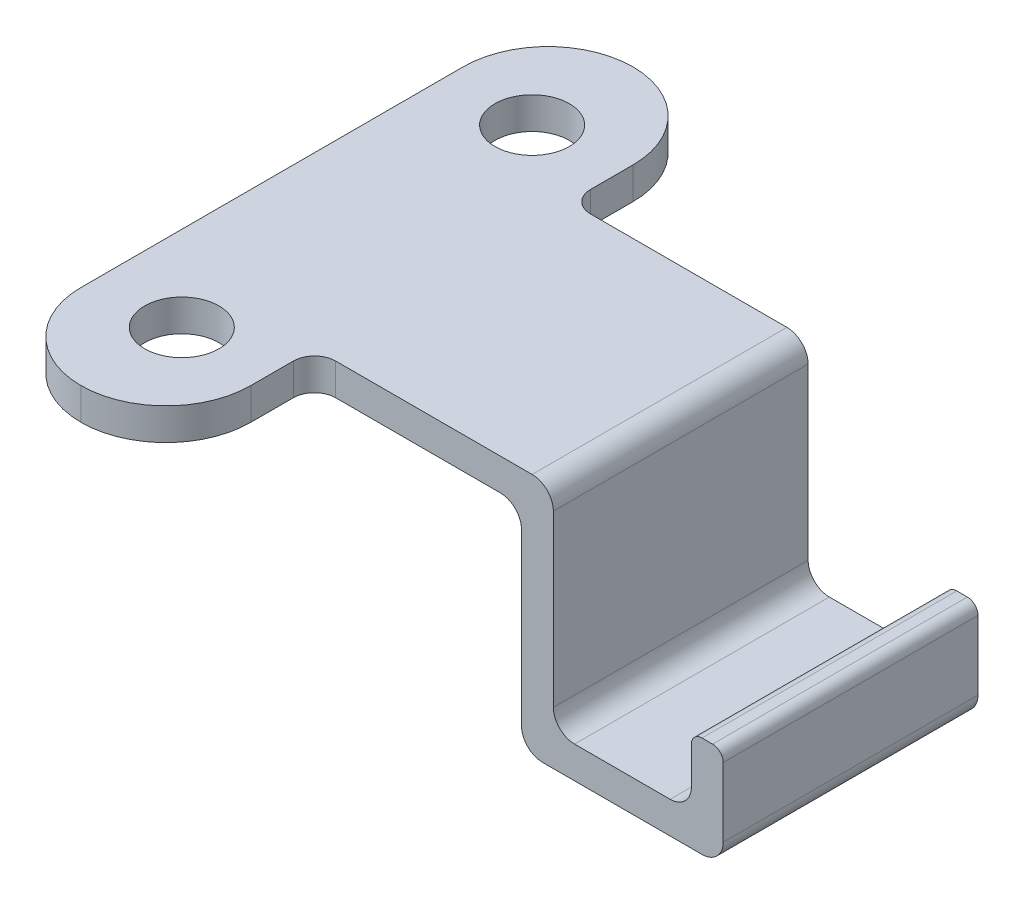
ISO-10303-21;
HEADER;
FILE_DESCRIPTION(('STEP AP214'),'2;1');
FILE_NAME('part.step','',(''),(''),'','','');
FILE_SCHEMA(('AUTOMOTIVE_DESIGN { 1 0 10303 214 1 1 1 1 }'));
ENDSEC;
DATA;
#1=APPLICATION_CONTEXT('core data for automotive mechanical design processes');
#2=APPLICATION_PROTOCOL_DEFINITION('international standard','automotive_design',2000,#1);
#3=PRODUCT_CONTEXT('',#1,'mechanical');
#4=PRODUCT('Part','Part','',(#3));
#5=PRODUCT_RELATED_PRODUCT_CATEGORY('part','',(#4));
#6=PRODUCT_DEFINITION_FORMATION('','',#4);
#7=PRODUCT_DEFINITION_CONTEXT('part definition',#1,'design');
#8=PRODUCT_DEFINITION('design','',#6,#7);
#9=PRODUCT_DEFINITION_SHAPE('','',#8);
#10=(LENGTH_UNIT() NAMED_UNIT(*) SI_UNIT(.MILLI.,.METRE.));
#11=(NAMED_UNIT(*) PLANE_ANGLE_UNIT() SI_UNIT($,.RADIAN.));
#12=(NAMED_UNIT(*) SI_UNIT($,.STERADIAN.) SOLID_ANGLE_UNIT());
#13=UNCERTAINTY_MEASURE_WITH_UNIT(LENGTH_MEASURE(1.E-05),#10,'distance_accuracy_value','');
#14=(GEOMETRIC_REPRESENTATION_CONTEXT(3) GLOBAL_UNCERTAINTY_ASSIGNED_CONTEXT((#13)) GLOBAL_UNIT_ASSIGNED_CONTEXT((#10,
#11,#12)) REPRESENTATION_CONTEXT('',''));
#15=CARTESIAN_POINT('',(0.,0.,0.));
#16=DIRECTION('',(0.,0.,1.));
#17=DIRECTION('',(1.,0.,0.));
#18=AXIS2_PLACEMENT_3D('',#15,#16,#17);
#19=CARTESIAN_POINT('',(0.,-0.75,13.));
#20=DIRECTION('',(1.,0.,0.));
#21=DIRECTION('',(0.,0.,-1.));
#22=AXIS2_PLACEMENT_3D('',#19,#20,#21);
#23=PLANE('',#22);
#24=DIRECTION('',(0.,0.,-1.));
#25=VECTOR('',#24,1.);
#26=CARTESIAN_POINT('',(0.,-0.75,13.));
#27=LINE('',#26,#25);
#28=CARTESIAN_POINT('',(0.,-0.75,9.));
#29=VERTEX_POINT('',#28);
#30=CARTESIAN_POINT('',(0.,-0.75,-8.99999999999999));
#31=VERTEX_POINT('',#30);
#32=EDGE_CURVE('E239',#29,#31,#27,.T.);
#33=ORIENTED_EDGE('',*,*,#32,.F.);
#34=DIRECTION('',(0.,-1.,0.));
#35=VECTOR('',#34,1.);
#36=CARTESIAN_POINT('',(0.,-0.75,9.));
#37=LINE('',#36,#35);
#38=CARTESIAN_POINT('',(0.,0.75,9.));
#39=VERTEX_POINT('',#38);
#40=EDGE_CURVE('E222',#29,#39,#37,.F.);
#41=ORIENTED_EDGE('',*,*,#40,.T.);
#42=DIRECTION('',(0.,0.,-1.));
#43=VECTOR('',#42,1.);
#44=CARTESIAN_POINT('',(0.,0.75,13.));
#45=LINE('',#44,#43);
#46=CARTESIAN_POINT('',(0.,0.75,-8.99999999999999));
#47=VERTEX_POINT('',#46);
#48=EDGE_CURVE('E244',#39,#47,#45,.T.);
#49=ORIENTED_EDGE('',*,*,#48,.T.);
#50=DIRECTION('',(0.,-1.,0.));
#51=VECTOR('',#50,1.);
#52=CARTESIAN_POINT('',(0.,-0.75,-9.));
#53=LINE('',#52,#51);
#54=EDGE_CURVE('E263',#47,#31,#53,.T.);
#55=ORIENTED_EDGE('',*,*,#54,.T.);
#56=EDGE_LOOP('',(#33,#41,#49,#55));
#57=FACE_BOUND('',#56,.T.);
#58=ADVANCED_FACE('F36',(#57),#23,.F.);
#59=CARTESIAN_POINT('',(0.,-0.75,13.));
#60=DIRECTION('',(0.,1.,0.));
#61=DIRECTION('',(0.,0.,1.));
#62=AXIS2_PLACEMENT_3D('',#59,#60,#61);
#63=PLANE('',#62);
#64=CARTESIAN_POINT('',(3.99999999999999,-0.75,-8.25));
#65=DIRECTION('',(0.,1.,0.));
#66=DIRECTION('',(0.,0.,1.));
#67=AXIS2_PLACEMENT_3D('',#64,#65,#66);
#68=CIRCLE('',#67,1.75);
#69=CARTESIAN_POINT('',(3.99999999999999,-0.75,-6.5));
#70=VERTEX_POINT('',#69);
#71=EDGE_CURVE('E424',#70,#70,#68,.T.);
#72=ORIENTED_EDGE('',*,*,#71,.T.);
#73=EDGE_LOOP('',(#72));
#74=FACE_BOUND('',#73,.T.);
#75=CARTESIAN_POINT('',(3.99999999999999,-0.75,8.25));
#76=DIRECTION('',(0.,1.,0.));
#77=DIRECTION('',(0.,0.,1.));
#78=AXIS2_PLACEMENT_3D('',#75,#76,#77);
#79=CIRCLE('',#78,1.75);
#80=CARTESIAN_POINT('',(3.99999999999999,-0.75,10.));
#81=VERTEX_POINT('',#80);
#82=EDGE_CURVE('E428',#81,#81,#79,.T.);
#83=ORIENTED_EDGE('',*,*,#82,.T.);
#84=EDGE_LOOP('',(#83));
#85=FACE_BOUND('',#84,.T.);
#86=DIRECTION('',(1.,0.,0.));
#87=VECTOR('',#86,1.);
#88=CARTESIAN_POINT('',(0.,-0.75,-6.));
#89=LINE('',#88,#87);
#90=CARTESIAN_POINT('',(9.,-0.75,-6.));
#91=VERTEX_POINT('',#90);
#92=CARTESIAN_POINT('',(16.75,-0.75,-6.));
#93=VERTEX_POINT('',#92);
#94=EDGE_CURVE('E394',#91,#93,#89,.T.);
#95=ORIENTED_EDGE('',*,*,#94,.T.);
#96=DIRECTION('',(0.,0.,-1.));
#97=VECTOR('',#96,1.);
#98=CARTESIAN_POINT('',(16.75,-0.75,6.));
#99=LINE('',#98,#97);
#100=CARTESIAN_POINT('',(16.75,-0.75,6.));
#101=VERTEX_POINT('',#100);
#102=EDGE_CURVE('E327',#93,#101,#99,.F.);
#103=ORIENTED_EDGE('',*,*,#102,.T.);
#104=DIRECTION('',(-1.,0.,0.));
#105=VECTOR('',#104,1.);
#106=CARTESIAN_POINT('',(0.,-0.75,6.));
#107=LINE('',#106,#105);
#108=CARTESIAN_POINT('',(9.,-0.75,6.));
#109=VERTEX_POINT('',#108);
#110=EDGE_CURVE('E449',#101,#109,#107,.T.);
#111=ORIENTED_EDGE('',*,*,#110,.T.);
#112=CARTESIAN_POINT('',(9.,-0.750000000000001,7.));
#113=DIRECTION('',(0.,1.,0.));
#114=DIRECTION('',(0.,0.,1.));
#115=AXIS2_PLACEMENT_3D('',#112,#113,#114);
#116=CIRCLE('',#115,1.);
#117=CARTESIAN_POINT('',(8.,-0.75,7.));
#118=VERTEX_POINT('',#117);
#119=EDGE_CURVE('E288',#109,#118,#116,.T.);
#120=ORIENTED_EDGE('',*,*,#119,.T.);
#121=DIRECTION('',(0.,0.,1.));
#122=VECTOR('',#121,1.);
#123=CARTESIAN_POINT('',(8.,-0.75,13.));
#124=LINE('',#123,#122);
#125=CARTESIAN_POINT('',(8.,-0.75,9.));
#126=VERTEX_POINT('',#125);
#127=EDGE_CURVE('E421',#118,#126,#124,.T.);
#128=ORIENTED_EDGE('',*,*,#127,.T.);
#129=CARTESIAN_POINT('',(4.,-0.75,9.));
#130=DIRECTION('',(0.,1.,0.));
#131=DIRECTION('',(0.,0.,1.));
#132=AXIS2_PLACEMENT_3D('',#129,#130,#131);
#133=CIRCLE('',#132,4.);
#134=CARTESIAN_POINT('',(4.,-0.75,13.));
#135=VERTEX_POINT('',#134);
#136=EDGE_CURVE('E261',#126,#135,#133,.F.);
#137=ORIENTED_EDGE('',*,*,#136,.T.);
#138=CARTESIAN_POINT('',(4.,-0.75,9.));
#139=DIRECTION('',(0.,1.,0.));
#140=DIRECTION('',(0.,0.,1.));
#141=AXIS2_PLACEMENT_3D('',#138,#139,#140);
#142=CIRCLE('',#141,4.);
#143=EDGE_CURVE('E259',#135,#29,#142,.F.);
#144=ORIENTED_EDGE('',*,*,#143,.T.);
#145=ORIENTED_EDGE('',*,*,#32,.T.);
#146=CARTESIAN_POINT('',(4.,-0.75,-9.));
#147=DIRECTION('',(0.,1.,0.));
#148=DIRECTION('',(0.,0.,1.));
#149=AXIS2_PLACEMENT_3D('',#146,#147,#148);
#150=CIRCLE('',#149,4.);
#151=CARTESIAN_POINT('',(3.99999999999999,-0.75,-13.));
#152=VERTEX_POINT('',#151);
#153=EDGE_CURVE('E257',#31,#152,#150,.F.);
#154=ORIENTED_EDGE('',*,*,#153,.T.);
#155=CARTESIAN_POINT('',(3.99999999999999,-0.750000000000001,-9.));
#156=DIRECTION('',(0.,1.,0.));
#157=DIRECTION('',(0.,0.,1.));
#158=AXIS2_PLACEMENT_3D('',#155,#156,#157);
#159=CIRCLE('',#158,4.);
#160=CARTESIAN_POINT('',(7.99999999999999,-0.75,-9.));
#161=VERTEX_POINT('',#160);
#162=EDGE_CURVE('E255',#152,#161,#159,.F.);
#163=ORIENTED_EDGE('',*,*,#162,.T.);
#164=DIRECTION('',(0.,0.,1.));
#165=VECTOR('',#164,1.);
#166=CARTESIAN_POINT('',(8.,-0.75,13.));
#167=LINE('',#166,#165);
#168=CARTESIAN_POINT('',(7.99999999999999,-0.75,-7.));
#169=VERTEX_POINT('',#168);
#170=EDGE_CURVE('E217',#161,#169,#167,.T.);
#171=ORIENTED_EDGE('',*,*,#170,.T.);
#172=CARTESIAN_POINT('',(9.,-0.750000000000001,-7.));
#173=DIRECTION('',(0.,1.,0.));
#174=DIRECTION('',(0.,0.,1.));
#175=AXIS2_PLACEMENT_3D('',#172,#173,#174);
#176=CIRCLE('',#175,1.);
#177=EDGE_CURVE('E283',#169,#91,#176,.T.);
#178=ORIENTED_EDGE('',*,*,#177,.T.);
#179=EDGE_LOOP('',(#95,#103,#111,#120,#128,#137,#144,#145,#154,#163,#171,#178));
#180=FACE_BOUND('',#179,.T.);
#181=ADVANCED_FACE('F406',(#74,#85,#180),#63,.F.);
#182=CARTESIAN_POINT('',(17.75,-0.75,13.));
#183=DIRECTION('',(1.,0.,0.));
#184=DIRECTION('',(0.,0.,-1.));
#185=AXIS2_PLACEMENT_3D('',#182,#183,#184);
#186=PLANE('',#185);
#187=DIRECTION('',(0.,-1.,0.));
#188=VECTOR('',#187,1.);
#189=CARTESIAN_POINT('',(17.75,-0.75,-6.));
#190=LINE('',#189,#188);
#191=CARTESIAN_POINT('',(17.75,-1.75,-6.));
#192=VERTEX_POINT('',#191);
#193=CARTESIAN_POINT('',(17.75,-9.75,-6.));
#194=VERTEX_POINT('',#193);
#195=EDGE_CURVE('E386',#192,#194,#190,.T.);
#196=ORIENTED_EDGE('',*,*,#195,.T.);
#197=DIRECTION('',(0.,0.,-1.));
#198=VECTOR('',#197,1.);
#199=CARTESIAN_POINT('',(17.75,-9.75,13.));
#200=LINE('',#199,#198);
#201=CARTESIAN_POINT('',(17.75,-9.75,6.));
#202=VERTEX_POINT('',#201);
#203=EDGE_CURVE('E325',#194,#202,#200,.F.);
#204=ORIENTED_EDGE('',*,*,#203,.T.);
#205=DIRECTION('',(0.,1.,0.));
#206=VECTOR('',#205,1.);
#207=CARTESIAN_POINT('',(17.75,-0.75,6.));
#208=LINE('',#207,#206);
#209=CARTESIAN_POINT('',(17.75,-1.75,6.));
#210=VERTEX_POINT('',#209);
#211=EDGE_CURVE('E446',#202,#210,#208,.T.);
#212=ORIENTED_EDGE('',*,*,#211,.T.);
#213=DIRECTION('',(0.,0.,-1.));
#214=VECTOR('',#213,1.);
#215=CARTESIAN_POINT('',(17.75,-1.75,-6.));
#216=LINE('',#215,#214);
#217=EDGE_CURVE('E322',#210,#192,#216,.T.);
#218=ORIENTED_EDGE('',*,*,#217,.T.);
#219=EDGE_LOOP('',(#196,#204,#212,#218));
#220=FACE_BOUND('',#219,.T.);
#221=ADVANCED_FACE('F487',(#220),#186,.F.);
#222=CARTESIAN_POINT('',(17.75,-10.75,13.));
#223=DIRECTION('',(0.,1.,0.));
#224=DIRECTION('',(0.,0.,1.));
#225=AXIS2_PLACEMENT_3D('',#222,#223,#224);
#226=PLANE('',#225);
#227=DIRECTION('',(1.,0.,0.));
#228=VECTOR('',#227,1.);
#229=CARTESIAN_POINT('',(17.75,-10.75,-6.));
#230=LINE('',#229,#228);
#231=CARTESIAN_POINT('',(18.75,-10.75,-6.));
#232=VERTEX_POINT('',#231);
#233=CARTESIAN_POINT('',(26.25,-10.75,-6.));
#234=VERTEX_POINT('',#233);
#235=EDGE_CURVE('E383',#232,#234,#230,.T.);
#236=ORIENTED_EDGE('',*,*,#235,.T.);
#237=DIRECTION('',(0.,0.,-1.));
#238=VECTOR('',#237,1.);
#239=CARTESIAN_POINT('',(26.25,-10.75,13.));
#240=LINE('',#239,#238);
#241=CARTESIAN_POINT('',(26.25,-10.75,5.99999999999999));
#242=VERTEX_POINT('',#241);
#243=EDGE_CURVE('E314',#234,#242,#240,.F.);
#244=ORIENTED_EDGE('',*,*,#243,.T.);
#245=DIRECTION('',(-1.,0.,0.));
#246=VECTOR('',#245,1.);
#247=CARTESIAN_POINT('',(17.75,-10.75,6.));
#248=LINE('',#247,#246);
#249=CARTESIAN_POINT('',(18.75,-10.75,6.));
#250=VERTEX_POINT('',#249);
#251=EDGE_CURVE('E443',#242,#250,#248,.T.);
#252=ORIENTED_EDGE('',*,*,#251,.T.);
#253=DIRECTION('',(0.,0.,-1.));
#254=VECTOR('',#253,1.);
#255=CARTESIAN_POINT('',(18.75,-10.75,13.));
#256=LINE('',#255,#254);
#257=EDGE_CURVE('E311',#250,#232,#256,.T.);
#258=ORIENTED_EDGE('',*,*,#257,.T.);
#259=EDGE_LOOP('',(#236,#244,#252,#258));
#260=FACE_BOUND('',#259,.T.);
#261=ADVANCED_FACE('F496',(#260),#226,.F.);
#262=CARTESIAN_POINT('',(27.25,-10.75,13.));
#263=DIRECTION('',(-1.,0.,0.));
#264=DIRECTION('',(0.,0.,1.));
#265=AXIS2_PLACEMENT_3D('',#262,#263,#264);
#266=PLANE('',#265);
#267=DIRECTION('',(0.,1.,0.));
#268=VECTOR('',#267,1.);
#269=CARTESIAN_POINT('',(27.25,-15.25,-6.));
#270=LINE('',#269,#268);
#271=CARTESIAN_POINT('',(27.25,-9.75,-6.));
#272=VERTEX_POINT('',#271);
#273=CARTESIAN_POINT('',(27.25,-6.5,-6.));
#274=VERTEX_POINT('',#273);
#275=EDGE_CURVE('E431',#272,#274,#270,.T.);
#276=ORIENTED_EDGE('',*,*,#275,.T.);
#277=DIRECTION('',(0.,0.,-1.));
#278=VECTOR('',#277,1.);
#279=CARTESIAN_POINT('',(27.25,-6.5,13.));
#280=LINE('',#279,#278);
#281=CARTESIAN_POINT('',(27.25,-6.5,5.99999999999999));
#282=VERTEX_POINT('',#281);
#283=EDGE_CURVE('E11',#274,#282,#280,.F.);
#284=ORIENTED_EDGE('',*,*,#283,.T.);
#285=DIRECTION('',(0.,1.,0.));
#286=VECTOR('',#285,1.);
#287=CARTESIAN_POINT('',(27.25,-15.25,5.99999999999999));
#288=LINE('',#287,#286);
#289=CARTESIAN_POINT('',(27.25,-9.75,5.99999999999999));
#290=VERTEX_POINT('',#289);
#291=EDGE_CURVE('E232',#290,#282,#288,.T.);
#292=ORIENTED_EDGE('',*,*,#291,.F.);
#293=DIRECTION('',(0.,0.,-1.));
#294=VECTOR('',#293,1.);
#295=CARTESIAN_POINT('',(27.25,-9.75,13.));
#296=LINE('',#295,#294);
#297=EDGE_CURVE('E302',#290,#272,#296,.T.);
#298=ORIENTED_EDGE('',*,*,#297,.T.);
#299=EDGE_LOOP('',(#276,#284,#292,#298));
#300=FACE_BOUND('',#299,.T.);
#301=ADVANCED_FACE('F504',(#300),#266,.F.);
#302=CARTESIAN_POINT('',(25.75,-6.,13.));
#303=DIRECTION('',(0.,-1.,0.));
#304=DIRECTION('',(0.,0.,-1.));
#305=AXIS2_PLACEMENT_3D('',#302,#303,#304);
#306=PLANE('',#305);
#307=DIRECTION('',(-1.,0.,0.));
#308=VECTOR('',#307,1.);
#309=CARTESIAN_POINT('',(25.75,-6.,-6.));
#310=LINE('',#309,#308);
#311=CARTESIAN_POINT('',(26.75,-6.,-6.));
#312=VERTEX_POINT('',#311);
#313=CARTESIAN_POINT('',(26.25,-6.,-6.));
#314=VERTEX_POINT('',#313);
#315=EDGE_CURVE('E378',#312,#314,#310,.T.);
#316=ORIENTED_EDGE('',*,*,#315,.T.);
#317=DIRECTION('',(0.,0.,-1.));
#318=VECTOR('',#317,1.);
#319=CARTESIAN_POINT('',(26.25,-6.,13.));
#320=LINE('',#319,#318);
#321=CARTESIAN_POINT('',(26.25,-6.,5.99999999999999));
#322=VERTEX_POINT('',#321);
#323=EDGE_CURVE('E355',#314,#322,#320,.F.);
#324=ORIENTED_EDGE('',*,*,#323,.T.);
#325=DIRECTION('',(1.,0.,0.));
#326=VECTOR('',#325,1.);
#327=CARTESIAN_POINT('',(25.75,-6.,5.99999999999999));
#328=LINE('',#327,#326);
#329=CARTESIAN_POINT('',(26.75,-6.,5.99999999999999));
#330=VERTEX_POINT('',#329);
#331=EDGE_CURVE('E363',#322,#330,#328,.T.);
#332=ORIENTED_EDGE('',*,*,#331,.T.);
#333=DIRECTION('',(0.,0.,-1.));
#334=VECTOR('',#333,1.);
#335=CARTESIAN_POINT('',(26.75,-6.,13.));
#336=LINE('',#335,#334);
#337=EDGE_CURVE('E352',#330,#312,#336,.T.);
#338=ORIENTED_EDGE('',*,*,#337,.T.);
#339=EDGE_LOOP('',(#316,#324,#332,#338));
#340=FACE_BOUND('',#339,.T.);
#341=ADVANCED_FACE('F381',(#340),#306,.F.);
#342=CARTESIAN_POINT('',(25.75,-9.25,13.));
#343=DIRECTION('',(1.,0.,0.));
#344=DIRECTION('',(0.,0.,-1.));
#345=AXIS2_PLACEMENT_3D('',#342,#343,#344);
#346=PLANE('',#345);
#347=DIRECTION('',(0.,1.,0.));
#348=VECTOR('',#347,1.);
#349=CARTESIAN_POINT('',(25.75,-9.25,5.99999999999999));
#350=LINE('',#349,#348);
#351=CARTESIAN_POINT('',(25.75,-8.25,5.99999999999999));
#352=VERTEX_POINT('',#351);
#353=CARTESIAN_POINT('',(25.75,-6.5,5.99999999999999));
#354=VERTEX_POINT('',#353);
#355=EDGE_CURVE('E361',#352,#354,#350,.T.);
#356=ORIENTED_EDGE('',*,*,#355,.T.);
#357=DIRECTION('',(0.,0.,-1.));
#358=VECTOR('',#357,1.);
#359=CARTESIAN_POINT('',(25.75,-6.5,13.));
#360=LINE('',#359,#358);
#361=CARTESIAN_POINT('',(25.75,-6.5,-6.));
#362=VERTEX_POINT('',#361);
#363=EDGE_CURVE('E345',#354,#362,#360,.T.);
#364=ORIENTED_EDGE('',*,*,#363,.T.);
#365=DIRECTION('',(0.,-1.,0.));
#366=VECTOR('',#365,1.);
#367=CARTESIAN_POINT('',(25.75,-9.25,-6.));
#368=LINE('',#367,#366);
#369=CARTESIAN_POINT('',(25.75,-8.25,-6.));
#370=VERTEX_POINT('',#369);
#371=EDGE_CURVE('E379',#362,#370,#368,.T.);
#372=ORIENTED_EDGE('',*,*,#371,.T.);
#373=DIRECTION('',(0.,0.,-1.));
#374=VECTOR('',#373,1.);
#375=CARTESIAN_POINT('',(25.75,-8.25,5.99999999999999));
#376=LINE('',#375,#374);
#377=EDGE_CURVE('E295',#370,#352,#376,.F.);
#378=ORIENTED_EDGE('',*,*,#377,.T.);
#379=EDGE_LOOP('',(#356,#364,#372,#378));
#380=FACE_BOUND('',#379,.T.);
#381=ADVANCED_FACE('F368',(#380),#346,.F.);
#382=CARTESIAN_POINT('',(19.25,-9.25,13.));
#383=DIRECTION('',(0.,-1.,0.));
#384=DIRECTION('',(0.,0.,-1.));
#385=AXIS2_PLACEMENT_3D('',#382,#383,#384);
#386=PLANE('',#385);
#387=DIRECTION('',(1.,0.,0.));
#388=VECTOR('',#387,1.);
#389=CARTESIAN_POINT('',(19.25,-9.25,6.));
#390=LINE('',#389,#388);
#391=CARTESIAN_POINT('',(20.25,-9.25,6.));
#392=VERTEX_POINT('',#391);
#393=CARTESIAN_POINT('',(24.75,-9.25,6.));
#394=VERTEX_POINT('',#393);
#395=EDGE_CURVE('E371',#392,#394,#390,.T.);
#396=ORIENTED_EDGE('',*,*,#395,.T.);
#397=DIRECTION('',(0.,0.,-1.));
#398=VECTOR('',#397,1.);
#399=CARTESIAN_POINT('',(24.75,-9.25,-6.));
#400=LINE('',#399,#398);
#401=CARTESIAN_POINT('',(24.75,-9.25,-6.));
#402=VERTEX_POINT('',#401);
#403=EDGE_CURVE('E292',#394,#402,#400,.T.);
#404=ORIENTED_EDGE('',*,*,#403,.T.);
#405=DIRECTION('',(-1.,0.,0.));
#406=VECTOR('',#405,1.);
#407=CARTESIAN_POINT('',(19.25,-9.25,-6.));
#408=LINE('',#407,#406);
#409=CARTESIAN_POINT('',(20.25,-9.25,-6.));
#410=VERTEX_POINT('',#409);
#411=EDGE_CURVE('E388',#402,#410,#408,.T.);
#412=ORIENTED_EDGE('',*,*,#411,.T.);
#413=DIRECTION('',(0.,0.,-1.));
#414=VECTOR('',#413,1.);
#415=CARTESIAN_POINT('',(20.25,-9.25,6.));
#416=LINE('',#415,#414);
#417=EDGE_CURVE('E290',#410,#392,#416,.F.);
#418=ORIENTED_EDGE('',*,*,#417,.T.);
#419=EDGE_LOOP('',(#396,#404,#412,#418));
#420=FACE_BOUND('',#419,.T.);
#421=ADVANCED_FACE('F457',(#420),#386,.F.);
#422=CARTESIAN_POINT('',(19.25,0.75,13.));
#423=DIRECTION('',(-1.,0.,0.));
#424=DIRECTION('',(0.,0.,1.));
#425=AXIS2_PLACEMENT_3D('',#422,#423,#424);
#426=PLANE('',#425);
#427=DIRECTION('',(0.,-1.,0.));
#428=VECTOR('',#427,1.);
#429=CARTESIAN_POINT('',(19.25,0.75,6.));
#430=LINE('',#429,#428);
#431=CARTESIAN_POINT('',(19.25,-0.25,6.));
#432=VERTEX_POINT('',#431);
#433=CARTESIAN_POINT('',(19.25,-8.25,6.));
#434=VERTEX_POINT('',#433);
#435=EDGE_CURVE('E437',#432,#434,#430,.T.);
#436=ORIENTED_EDGE('',*,*,#435,.T.);
#437=DIRECTION('',(0.,0.,-1.));
#438=VECTOR('',#437,1.);
#439=CARTESIAN_POINT('',(19.25,-8.25,-6.));
#440=LINE('',#439,#438);
#441=CARTESIAN_POINT('',(19.25,-8.25,-6.));
#442=VERTEX_POINT('',#441);
#443=EDGE_CURVE('E299',#434,#442,#440,.T.);
#444=ORIENTED_EDGE('',*,*,#443,.T.);
#445=DIRECTION('',(0.,1.,0.));
#446=VECTOR('',#445,1.);
#447=CARTESIAN_POINT('',(19.25,0.75,-6.));
#448=LINE('',#447,#446);
#449=CARTESIAN_POINT('',(19.25,-0.25,-6.));
#450=VERTEX_POINT('',#449);
#451=EDGE_CURVE('E451',#442,#450,#448,.T.);
#452=ORIENTED_EDGE('',*,*,#451,.T.);
#453=DIRECTION('',(0.,0.,-1.));
#454=VECTOR('',#453,1.);
#455=CARTESIAN_POINT('',(19.25,-0.25,13.));
#456=LINE('',#455,#454);
#457=EDGE_CURVE('E297',#450,#432,#456,.F.);
#458=ORIENTED_EDGE('',*,*,#457,.T.);
#459=EDGE_LOOP('',(#436,#444,#452,#458));
#460=FACE_BOUND('',#459,.T.);
#461=ADVANCED_FACE('F467',(#460),#426,.F.);
#462=CARTESIAN_POINT('',(0.,0.75,13.));
#463=DIRECTION('',(0.,-1.,0.));
#464=DIRECTION('',(0.,0.,-1.));
#465=AXIS2_PLACEMENT_3D('',#462,#463,#464);
#466=PLANE('',#465);
#467=CARTESIAN_POINT('',(3.99999999999999,0.75,-8.25));
#468=DIRECTION('',(0.,1.,0.));
#469=DIRECTION('',(0.,0.,1.));
#470=AXIS2_PLACEMENT_3D('',#467,#468,#469);
#471=CIRCLE('',#470,1.75);
#472=CARTESIAN_POINT('',(3.99999999999999,0.75,-6.5));
#473=VERTEX_POINT('',#472);
#474=EDGE_CURVE('E508',#473,#473,#471,.T.);
#475=ORIENTED_EDGE('',*,*,#474,.F.);
#476=EDGE_LOOP('',(#475));
#477=FACE_BOUND('',#476,.T.);
#478=CARTESIAN_POINT('',(3.99999999999999,0.75,8.25));
#479=DIRECTION('',(0.,1.,0.));
#480=DIRECTION('',(0.,0.,1.));
#481=AXIS2_PLACEMENT_3D('',#478,#479,#480);
#482=CIRCLE('',#481,1.75);
#483=CARTESIAN_POINT('',(3.99999999999999,0.75,10.));
#484=VERTEX_POINT('',#483);
#485=EDGE_CURVE('E270',#484,#484,#482,.T.);
#486=ORIENTED_EDGE('',*,*,#485,.F.);
#487=EDGE_LOOP('',(#486));
#488=FACE_BOUND('',#487,.T.);
#489=DIRECTION('',(-1.,0.,0.));
#490=VECTOR('',#489,1.);
#491=CARTESIAN_POINT('',(8.,0.75,6.));
#492=LINE('',#491,#490);
#493=CARTESIAN_POINT('',(18.25,0.75,6.));
#494=VERTEX_POINT('',#493);
#495=CARTESIAN_POINT('',(9.,0.75,6.));
#496=VERTEX_POINT('',#495);
#497=EDGE_CURVE('E423',#494,#496,#492,.T.);
#498=ORIENTED_EDGE('',*,*,#497,.F.);
#499=DIRECTION('',(0.,0.,-1.));
#500=VECTOR('',#499,1.);
#501=CARTESIAN_POINT('',(18.25,0.75,13.));
#502=LINE('',#501,#500);
#503=CARTESIAN_POINT('',(18.25,0.75,-6.));
#504=VERTEX_POINT('',#503);
#505=EDGE_CURVE('E329',#494,#504,#502,.T.);
#506=ORIENTED_EDGE('',*,*,#505,.T.);
#507=DIRECTION('',(1.,0.,0.));
#508=VECTOR('',#507,1.);
#509=CARTESIAN_POINT('',(7.99999999999999,0.75,-6.));
#510=LINE('',#509,#508);
#511=CARTESIAN_POINT('',(9.,0.75,-6.));
#512=VERTEX_POINT('',#511);
#513=EDGE_CURVE('E231',#512,#504,#510,.T.);
#514=ORIENTED_EDGE('',*,*,#513,.F.);
#515=CARTESIAN_POINT('',(9.,0.750000000000001,-7.));
#516=DIRECTION('',(0.,-1.,0.));
#517=DIRECTION('',(0.,0.,-1.));
#518=AXIS2_PLACEMENT_3D('',#515,#516,#517);
#519=CIRCLE('',#518,1.);
#520=CARTESIAN_POINT('',(7.99999999999999,0.75,-7.));
#521=VERTEX_POINT('',#520);
#522=EDGE_CURVE('E230',#512,#521,#519,.T.);
#523=ORIENTED_EDGE('',*,*,#522,.T.);
#524=DIRECTION('',(0.,0.,1.));
#525=VECTOR('',#524,1.);
#526=CARTESIAN_POINT('',(7.99999999999999,0.75,-13.));
#527=LINE('',#526,#525);
#528=CARTESIAN_POINT('',(7.99999999999999,0.75,-9.));
#529=VERTEX_POINT('',#528);
#530=EDGE_CURVE('E214',#529,#521,#527,.T.);
#531=ORIENTED_EDGE('',*,*,#530,.F.);
#532=CARTESIAN_POINT('',(3.99999999999999,0.750000000000001,-9.));
#533=DIRECTION('',(0.,-1.,0.));
#534=DIRECTION('',(0.,0.,-1.));
#535=AXIS2_PLACEMENT_3D('',#532,#533,#534);
#536=CIRCLE('',#535,4.);
#537=CARTESIAN_POINT('',(3.99999999999999,0.75,-13.));
#538=VERTEX_POINT('',#537);
#539=EDGE_CURVE('E227',#529,#538,#536,.F.);
#540=ORIENTED_EDGE('',*,*,#539,.T.);
#541=CARTESIAN_POINT('',(4.,0.75,-9.));
#542=DIRECTION('',(0.,-1.,0.));
#543=DIRECTION('',(0.,0.,-1.));
#544=AXIS2_PLACEMENT_3D('',#541,#542,#543);
#545=CIRCLE('',#544,4.);
#546=EDGE_CURVE('E238',#538,#47,#545,.F.);
#547=ORIENTED_EDGE('',*,*,#546,.T.);
#548=ORIENTED_EDGE('',*,*,#48,.F.);
#549=CARTESIAN_POINT('',(4.,0.75,9.));
#550=DIRECTION('',(0.,-1.,0.));
#551=DIRECTION('',(0.,0.,-1.));
#552=AXIS2_PLACEMENT_3D('',#549,#550,#551);
#553=CIRCLE('',#552,4.);
#554=CARTESIAN_POINT('',(4.,0.75,13.));
#555=VERTEX_POINT('',#554);
#556=EDGE_CURVE('E241',#39,#555,#553,.F.);
#557=ORIENTED_EDGE('',*,*,#556,.T.);
#558=CARTESIAN_POINT('',(4.,0.75,9.));
#559=DIRECTION('',(0.,-1.,0.));
#560=DIRECTION('',(0.,0.,-1.));
#561=AXIS2_PLACEMENT_3D('',#558,#559,#560);
#562=CIRCLE('',#561,4.);
#563=CARTESIAN_POINT('',(8.,0.75,9.));
#564=VERTEX_POINT('',#563);
#565=EDGE_CURVE('E249',#555,#564,#562,.F.);
#566=ORIENTED_EDGE('',*,*,#565,.T.);
#567=DIRECTION('',(0.,0.,1.));
#568=VECTOR('',#567,1.);
#569=CARTESIAN_POINT('',(8.,0.75,13.));
#570=LINE('',#569,#568);
#571=CARTESIAN_POINT('',(8.,0.75,7.));
#572=VERTEX_POINT('',#571);
#573=EDGE_CURVE('E414',#572,#564,#570,.T.);
#574=ORIENTED_EDGE('',*,*,#573,.F.);
#575=CARTESIAN_POINT('',(9.,0.750000000000001,7.));
#576=DIRECTION('',(0.,-1.,0.));
#577=DIRECTION('',(0.,0.,-1.));
#578=AXIS2_PLACEMENT_3D('',#575,#576,#577);
#579=CIRCLE('',#578,1.);
#580=EDGE_CURVE('E285',#572,#496,#579,.T.);
#581=ORIENTED_EDGE('',*,*,#580,.T.);
#582=EDGE_LOOP('',(#498,#506,#514,#523,#531,#540,#547,#548,#557,#566,#574,#581));
#583=FACE_BOUND('',#582,.T.);
#584=ADVANCED_FACE('F226',(#477,#488,#583),#466,.F.);
#585=CARTESIAN_POINT('',(7.99999999999999,-15.25,-6.));
#586=DIRECTION('',(0.,0.,1.));
#587=DIRECTION('',(1.,0.,0.));
#588=AXIS2_PLACEMENT_3D('',#585,#586,#587);
#589=PLANE('',#588);
#590=ORIENTED_EDGE('',*,*,#371,.F.);
#591=CARTESIAN_POINT('',(26.25,-6.5,-6.));
#592=DIRECTION('',(0.,0.,1.));
#593=DIRECTION('',(1.,0.,0.));
#594=AXIS2_PLACEMENT_3D('',#591,#592,#593);
#595=CIRCLE('',#594,0.5);
#596=EDGE_CURVE('E350',#362,#314,#595,.F.);
#597=ORIENTED_EDGE('',*,*,#596,.T.);
#598=ORIENTED_EDGE('',*,*,#315,.F.);
#599=CARTESIAN_POINT('',(26.75,-6.5,-6.));
#600=DIRECTION('',(0.,0.,1.));
#601=DIRECTION('',(1.,0.,0.));
#602=AXIS2_PLACEMENT_3D('',#599,#600,#601);
#603=CIRCLE('',#602,0.5);
#604=EDGE_CURVE('E348',#312,#274,#603,.F.);
#605=ORIENTED_EDGE('',*,*,#604,.T.);
#606=ORIENTED_EDGE('',*,*,#275,.F.);
#607=CARTESIAN_POINT('',(26.25,-9.75,-6.));
#608=DIRECTION('',(0.,0.,1.));
#609=DIRECTION('',(1.,0.,0.));
#610=AXIS2_PLACEMENT_3D('',#607,#608,#609);
#611=CIRCLE('',#610,1.);
#612=EDGE_CURVE('E309',#272,#234,#611,.F.);
#613=ORIENTED_EDGE('',*,*,#612,.T.);
#614=ORIENTED_EDGE('',*,*,#235,.F.);
#615=CARTESIAN_POINT('',(18.75,-9.75,-6.));
#616=DIRECTION('',(0.,0.,1.));
#617=DIRECTION('',(1.,0.,0.));
#618=AXIS2_PLACEMENT_3D('',#615,#616,#617);
#619=CIRCLE('',#618,1.);
#620=EDGE_CURVE('E307',#232,#194,#619,.F.);
#621=ORIENTED_EDGE('',*,*,#620,.T.);
#622=ORIENTED_EDGE('',*,*,#195,.F.);
#623=CARTESIAN_POINT('',(16.75,-1.75,-6.));
#624=DIRECTION('',(0.,0.,1.));
#625=DIRECTION('',(1.,0.,0.));
#626=AXIS2_PLACEMENT_3D('',#623,#624,#625);
#627=CIRCLE('',#626,1.);
#628=EDGE_CURVE('E341',#192,#93,#627,.T.);
#629=ORIENTED_EDGE('',*,*,#628,.T.);
#630=ORIENTED_EDGE('',*,*,#94,.F.);
#631=DIRECTION('',(0.,1.,0.));
#632=VECTOR('',#631,1.);
#633=CARTESIAN_POINT('',(9.,0.750000000000001,-6.));
#634=LINE('',#633,#632);
#635=EDGE_CURVE('E221',#91,#512,#634,.T.);
#636=ORIENTED_EDGE('',*,*,#635,.T.);
#637=ORIENTED_EDGE('',*,*,#513,.T.);
#638=CARTESIAN_POINT('',(18.25,-0.25,-6.));
#639=DIRECTION('',(0.,0.,1.));
#640=DIRECTION('',(1.,0.,0.));
#641=AXIS2_PLACEMENT_3D('',#638,#639,#640);
#642=CIRCLE('',#641,1.);
#643=EDGE_CURVE('E305',#504,#450,#642,.F.);
#644=ORIENTED_EDGE('',*,*,#643,.T.);
#645=ORIENTED_EDGE('',*,*,#451,.F.);
#646=CARTESIAN_POINT('',(20.25,-8.25,-6.));
#647=DIRECTION('',(0.,0.,1.));
#648=DIRECTION('',(1.,0.,0.));
#649=AXIS2_PLACEMENT_3D('',#646,#647,#648);
#650=CIRCLE('',#649,1.);
#651=EDGE_CURVE('E337',#442,#410,#650,.T.);
#652=ORIENTED_EDGE('',*,*,#651,.T.);
#653=ORIENTED_EDGE('',*,*,#411,.F.);
#654=CARTESIAN_POINT('',(24.75,-8.25,-6.));
#655=DIRECTION('',(0.,0.,1.));
#656=DIRECTION('',(1.,0.,0.));
#657=AXIS2_PLACEMENT_3D('',#654,#655,#656);
#658=CIRCLE('',#657,1.);
#659=EDGE_CURVE('E332',#402,#370,#658,.T.);
#660=ORIENTED_EDGE('',*,*,#659,.T.);
#661=EDGE_LOOP('',(#590,#597,#598,#605,#606,#613,#614,#621,#622,#629,#630,#636,#637,#644,#645,
#652,#653,#660));
#662=FACE_BOUND('',#661,.T.);
#663=ADVANCED_FACE('F377',(#662),#589,.F.);
#664=CARTESIAN_POINT('',(7.99999999999999,-15.25,-13.));
#665=DIRECTION('',(-1.,0.,0.));
#666=DIRECTION('',(0.,0.,1.));
#667=AXIS2_PLACEMENT_3D('',#664,#665,#666);
#668=PLANE('',#667);
#669=ORIENTED_EDGE('',*,*,#530,.T.);
#670=DIRECTION('',(0.,1.,0.));
#671=VECTOR('',#670,1.);
#672=CARTESIAN_POINT('',(7.99999999999999,-0.750000000000001,-7.));
#673=LINE('',#672,#671);
#674=EDGE_CURVE('E274',#521,#169,#673,.F.);
#675=ORIENTED_EDGE('',*,*,#674,.T.);
#676=ORIENTED_EDGE('',*,*,#170,.F.);
#677=DIRECTION('',(0.,1.,0.));
#678=VECTOR('',#677,1.);
#679=CARTESIAN_POINT('',(7.99999999999999,0.750000000000001,-9.));
#680=LINE('',#679,#678);
#681=EDGE_CURVE('E211',#161,#529,#680,.T.);
#682=ORIENTED_EDGE('',*,*,#681,.T.);
#683=EDGE_LOOP('',(#669,#675,#676,#682));
#684=FACE_BOUND('',#683,.T.);
#685=ADVANCED_FACE('F213',(#684),#668,.F.);
#686=CARTESIAN_POINT('',(8.,-15.25,6.));
#687=DIRECTION('',(0.,0.,-1.));
#688=DIRECTION('',(-1.,0.,0.));
#689=AXIS2_PLACEMENT_3D('',#686,#687,#688);
#690=PLANE('',#689);
#691=ORIENTED_EDGE('',*,*,#331,.F.);
#692=CARTESIAN_POINT('',(26.25,-6.5,5.99999999999999));
#693=DIRECTION('',(0.,0.,-1.));
#694=DIRECTION('',(-1.,0.,0.));
#695=AXIS2_PLACEMENT_3D('',#692,#693,#694);
#696=CIRCLE('',#695,0.5);
#697=EDGE_CURVE('E44',#322,#354,#696,.F.);
#698=ORIENTED_EDGE('',*,*,#697,.T.);
#699=ORIENTED_EDGE('',*,*,#355,.F.);
#700=CARTESIAN_POINT('',(24.75,-8.25,6.));
#701=DIRECTION('',(0.,0.,-1.));
#702=DIRECTION('',(-1.,0.,0.));
#703=AXIS2_PLACEMENT_3D('',#700,#701,#702);
#704=CIRCLE('',#703,1.);
#705=EDGE_CURVE('E335',#352,#394,#704,.T.);
#706=ORIENTED_EDGE('',*,*,#705,.T.);
#707=ORIENTED_EDGE('',*,*,#395,.F.);
#708=CARTESIAN_POINT('',(20.25,-8.25,6.));
#709=DIRECTION('',(0.,0.,-1.));
#710=DIRECTION('',(-1.,0.,0.));
#711=AXIS2_PLACEMENT_3D('',#708,#709,#710);
#712=CIRCLE('',#711,1.);
#713=EDGE_CURVE('E339',#392,#434,#712,.T.);
#714=ORIENTED_EDGE('',*,*,#713,.T.);
#715=ORIENTED_EDGE('',*,*,#435,.F.);
#716=CARTESIAN_POINT('',(18.25,-0.25,6.));
#717=DIRECTION('',(0.,0.,-1.));
#718=DIRECTION('',(-1.,0.,0.));
#719=AXIS2_PLACEMENT_3D('',#716,#717,#718);
#720=CIRCLE('',#719,1.);
#721=EDGE_CURVE('E316',#432,#494,#720,.F.);
#722=ORIENTED_EDGE('',*,*,#721,.T.);
#723=ORIENTED_EDGE('',*,*,#497,.T.);
#724=DIRECTION('',(0.,1.,0.));
#725=VECTOR('',#724,1.);
#726=CARTESIAN_POINT('',(9.,-0.750000000000001,6.));
#727=LINE('',#726,#725);
#728=EDGE_CURVE('E279',#496,#109,#727,.F.);
#729=ORIENTED_EDGE('',*,*,#728,.T.);
#730=ORIENTED_EDGE('',*,*,#110,.F.);
#731=CARTESIAN_POINT('',(16.75,-1.75,6.));
#732=DIRECTION('',(0.,0.,-1.));
#733=DIRECTION('',(-1.,0.,0.));
#734=AXIS2_PLACEMENT_3D('',#731,#732,#733);
#735=CIRCLE('',#734,1.);
#736=EDGE_CURVE('E343',#101,#210,#735,.T.);
#737=ORIENTED_EDGE('',*,*,#736,.T.);
#738=ORIENTED_EDGE('',*,*,#211,.F.);
#739=CARTESIAN_POINT('',(18.75,-9.75,6.));
#740=DIRECTION('',(0.,0.,-1.));
#741=DIRECTION('',(-1.,0.,0.));
#742=AXIS2_PLACEMENT_3D('',#739,#740,#741);
#743=CIRCLE('',#742,1.);
#744=EDGE_CURVE('E318',#202,#250,#743,.F.);
#745=ORIENTED_EDGE('',*,*,#744,.T.);
#746=ORIENTED_EDGE('',*,*,#251,.F.);
#747=CARTESIAN_POINT('',(26.25,-9.75,5.99999999999999));
#748=DIRECTION('',(0.,0.,-1.));
#749=DIRECTION('',(-1.,0.,0.));
#750=AXIS2_PLACEMENT_3D('',#747,#748,#749);
#751=CIRCLE('',#750,1.);
#752=EDGE_CURVE('E320',#242,#290,#751,.F.);
#753=ORIENTED_EDGE('',*,*,#752,.T.);
#754=ORIENTED_EDGE('',*,*,#291,.T.);
#755=CARTESIAN_POINT('',(26.75,-6.5,5.99999999999999));
#756=DIRECTION('',(0.,0.,-1.));
#757=DIRECTION('',(-1.,0.,0.));
#758=AXIS2_PLACEMENT_3D('',#755,#756,#757);
#759=CIRCLE('',#758,0.5);
#760=EDGE_CURVE('E56',#282,#330,#759,.F.);
#761=ORIENTED_EDGE('',*,*,#760,.T.);
#762=EDGE_LOOP('',(#691,#698,#699,#706,#707,#714,#715,#722,#723,#729,#730,#737,#738,#745,#746,
#753,#754,#761));
#763=FACE_BOUND('',#762,.T.);
#764=ADVANCED_FACE('F360',(#763),#690,.F.);
#765=CARTESIAN_POINT('',(8.,-15.25,13.));
#766=DIRECTION('',(-1.,0.,0.));
#767=DIRECTION('',(0.,0.,1.));
#768=AXIS2_PLACEMENT_3D('',#765,#766,#767);
#769=PLANE('',#768);
#770=ORIENTED_EDGE('',*,*,#127,.F.);
#771=DIRECTION('',(0.,1.,0.));
#772=VECTOR('',#771,1.);
#773=CARTESIAN_POINT('',(8.,0.750000000000001,7.));
#774=LINE('',#773,#772);
#775=EDGE_CURVE('E276',#118,#572,#774,.T.);
#776=ORIENTED_EDGE('',*,*,#775,.T.);
#777=ORIENTED_EDGE('',*,*,#573,.T.);
#778=DIRECTION('',(0.,1.,0.));
#779=VECTOR('',#778,1.);
#780=CARTESIAN_POINT('',(8.,-15.25,9.));
#781=LINE('',#780,#779);
#782=EDGE_CURVE('E252',#564,#126,#781,.F.);
#783=ORIENTED_EDGE('',*,*,#782,.T.);
#784=EDGE_LOOP('',(#770,#776,#777,#783));
#785=FACE_BOUND('',#784,.T.);
#786=ADVANCED_FACE('F420',(#785),#769,.F.);
#787=CARTESIAN_POINT('',(3.99999999999999,-5.25,8.25));
#788=DIRECTION('',(0.,1.,0.));
#789=DIRECTION('',(0.,0.,1.));
#790=AXIS2_PLACEMENT_3D('',#787,#788,#789);
#791=CYLINDRICAL_SURFACE('',#790,1.75);
#792=ORIENTED_EDGE('',*,*,#485,.T.);
#793=EDGE_LOOP('',(#792));
#794=FACE_BOUND('',#793,.T.);
#795=ORIENTED_EDGE('',*,*,#82,.F.);
#796=EDGE_LOOP('',(#795));
#797=FACE_BOUND('',#796,.T.);
#798=ADVANCED_FACE('F522',(#794,#797),#791,.F.);
#799=CARTESIAN_POINT('',(3.99999999999999,-5.25,-8.25));
#800=DIRECTION('',(0.,1.,0.));
#801=DIRECTION('',(0.,0.,1.));
#802=AXIS2_PLACEMENT_3D('',#799,#800,#801);
#803=CYLINDRICAL_SURFACE('',#802,1.75);
#804=ORIENTED_EDGE('',*,*,#474,.T.);
#805=EDGE_LOOP('',(#804));
#806=FACE_BOUND('',#805,.T.);
#807=ORIENTED_EDGE('',*,*,#71,.F.);
#808=EDGE_LOOP('',(#807));
#809=FACE_BOUND('',#808,.T.);
#810=ADVANCED_FACE('F514',(#806,#809),#803,.F.);
#811=CARTESIAN_POINT('',(4.,0.,9.));
#812=DIRECTION('',(0.,-1.,0.));
#813=DIRECTION('',(0.,0.,-1.));
#814=AXIS2_PLACEMENT_3D('',#811,#812,#813);
#815=CYLINDRICAL_SURFACE('',#814,4.);
#816=ORIENTED_EDGE('',*,*,#40,.F.);
#817=ORIENTED_EDGE('',*,*,#143,.F.);
#818=DIRECTION('',(0.,-1.,0.));
#819=VECTOR('',#818,1.);
#820=CARTESIAN_POINT('',(4.,0.,13.));
#821=LINE('',#820,#819);
#822=EDGE_CURVE('E267',#555,#135,#821,.T.);
#823=ORIENTED_EDGE('',*,*,#822,.F.);
#824=ORIENTED_EDGE('',*,*,#556,.F.);
#825=EDGE_LOOP('',(#816,#817,#823,#824));
#826=FACE_BOUND('',#825,.T.);
#827=ADVANCED_FACE('F409',(#826),#815,.T.);
#828=CARTESIAN_POINT('',(4.,0.,9.));
#829=DIRECTION('',(0.,1.,0.));
#830=DIRECTION('',(0.,0.,1.));
#831=AXIS2_PLACEMENT_3D('',#828,#829,#830);
#832=CYLINDRICAL_SURFACE('',#831,4.);
#833=ORIENTED_EDGE('',*,*,#136,.F.);
#834=ORIENTED_EDGE('',*,*,#782,.F.);
#835=ORIENTED_EDGE('',*,*,#565,.F.);
#836=ORIENTED_EDGE('',*,*,#822,.T.);
#837=EDGE_LOOP('',(#833,#834,#835,#836));
#838=FACE_BOUND('',#837,.T.);
#839=ADVANCED_FACE('F417',(#838),#832,.T.);
#840=CARTESIAN_POINT('',(3.99999999999999,-15.25,-9.));
#841=DIRECTION('',(0.,-1.,0.));
#842=DIRECTION('',(0.,0.,-1.));
#843=AXIS2_PLACEMENT_3D('',#840,#841,#842);
#844=CYLINDRICAL_SURFACE('',#843,4.);
#845=DIRECTION('',(0.,1.,0.));
#846=VECTOR('',#845,1.);
#847=CARTESIAN_POINT('',(3.99999999999999,-0.750000000000001,-13.));
#848=LINE('',#847,#846);
#849=EDGE_CURVE('E236',#538,#152,#848,.F.);
#850=ORIENTED_EDGE('',*,*,#849,.F.);
#851=ORIENTED_EDGE('',*,*,#539,.F.);
#852=ORIENTED_EDGE('',*,*,#681,.F.);
#853=ORIENTED_EDGE('',*,*,#162,.F.);
#854=EDGE_LOOP('',(#850,#851,#852,#853));
#855=FACE_BOUND('',#854,.T.);
#856=ADVANCED_FACE('F234',(#855),#844,.T.);
#857=CARTESIAN_POINT('',(4.,-0.75,-9.));
#858=DIRECTION('',(0.,1.,0.));
#859=DIRECTION('',(0.,0.,1.));
#860=AXIS2_PLACEMENT_3D('',#857,#858,#859);
#861=CYLINDRICAL_SURFACE('',#860,4.);
#862=ORIENTED_EDGE('',*,*,#546,.F.);
#863=ORIENTED_EDGE('',*,*,#849,.T.);
#864=ORIENTED_EDGE('',*,*,#153,.F.);
#865=ORIENTED_EDGE('',*,*,#54,.F.);
#866=EDGE_LOOP('',(#862,#863,#864,#865));
#867=FACE_BOUND('',#866,.T.);
#868=ADVANCED_FACE('F404',(#867),#861,.T.);
#869=CARTESIAN_POINT('',(9.,-15.25,-7.));
#870=DIRECTION('',(0.,-1.,0.));
#871=DIRECTION('',(0.,0.,-1.));
#872=AXIS2_PLACEMENT_3D('',#869,#870,#871);
#873=CYLINDRICAL_SURFACE('',#872,1.);
#874=ORIENTED_EDGE('',*,*,#177,.F.);
#875=ORIENTED_EDGE('',*,*,#674,.F.);
#876=ORIENTED_EDGE('',*,*,#522,.F.);
#877=ORIENTED_EDGE('',*,*,#635,.F.);
#878=EDGE_LOOP('',(#874,#875,#876,#877));
#879=FACE_BOUND('',#878,.T.);
#880=ADVANCED_FACE('F545',(#879),#873,.F.);
#881=CARTESIAN_POINT('',(9.,-15.25,7.));
#882=DIRECTION('',(0.,-1.,0.));
#883=DIRECTION('',(0.,0.,-1.));
#884=AXIS2_PLACEMENT_3D('',#881,#882,#883);
#885=CYLINDRICAL_SURFACE('',#884,1.);
#886=ORIENTED_EDGE('',*,*,#119,.F.);
#887=ORIENTED_EDGE('',*,*,#728,.F.);
#888=ORIENTED_EDGE('',*,*,#580,.F.);
#889=ORIENTED_EDGE('',*,*,#775,.F.);
#890=EDGE_LOOP('',(#886,#887,#888,#889));
#891=FACE_BOUND('',#890,.T.);
#892=ADVANCED_FACE('F477',(#891),#885,.F.);
#893=CARTESIAN_POINT('',(24.75,-8.25,13.));
#894=DIRECTION('',(0.,0.,1.));
#895=DIRECTION('',(1.,0.,0.));
#896=AXIS2_PLACEMENT_3D('',#893,#894,#895);
#897=CYLINDRICAL_SURFACE('',#896,1.);
#898=ORIENTED_EDGE('',*,*,#705,.F.);
#899=ORIENTED_EDGE('',*,*,#377,.F.);
#900=ORIENTED_EDGE('',*,*,#659,.F.);
#901=ORIENTED_EDGE('',*,*,#403,.F.);
#902=EDGE_LOOP('',(#898,#899,#900,#901));
#903=FACE_BOUND('',#902,.T.);
#904=ADVANCED_FACE('F553',(#903),#897,.F.);
#905=CARTESIAN_POINT('',(20.25,-8.25,13.));
#906=DIRECTION('',(0.,0.,1.));
#907=DIRECTION('',(1.,0.,0.));
#908=AXIS2_PLACEMENT_3D('',#905,#906,#907);
#909=CYLINDRICAL_SURFACE('',#908,1.);
#910=ORIENTED_EDGE('',*,*,#713,.F.);
#911=ORIENTED_EDGE('',*,*,#417,.F.);
#912=ORIENTED_EDGE('',*,*,#651,.F.);
#913=ORIENTED_EDGE('',*,*,#443,.F.);
#914=EDGE_LOOP('',(#910,#911,#912,#913));
#915=FACE_BOUND('',#914,.T.);
#916=ADVANCED_FACE('F462',(#915),#909,.F.);
#917=CARTESIAN_POINT('',(26.25,-9.75,13.));
#918=DIRECTION('',(0.,0.,-1.));
#919=DIRECTION('',(-1.,0.,0.));
#920=AXIS2_PLACEMENT_3D('',#917,#918,#919);
#921=CYLINDRICAL_SURFACE('',#920,1.);
#922=ORIENTED_EDGE('',*,*,#752,.F.);
#923=ORIENTED_EDGE('',*,*,#243,.F.);
#924=ORIENTED_EDGE('',*,*,#612,.F.);
#925=ORIENTED_EDGE('',*,*,#297,.F.);
#926=EDGE_LOOP('',(#922,#923,#924,#925));
#927=FACE_BOUND('',#926,.T.);
#928=ADVANCED_FACE('F502',(#927),#921,.T.);
#929=CARTESIAN_POINT('',(18.75,-9.75,13.));
#930=DIRECTION('',(0.,0.,-1.));
#931=DIRECTION('',(-1.,0.,0.));
#932=AXIS2_PLACEMENT_3D('',#929,#930,#931);
#933=CYLINDRICAL_SURFACE('',#932,1.);
#934=ORIENTED_EDGE('',*,*,#744,.F.);
#935=ORIENTED_EDGE('',*,*,#203,.F.);
#936=ORIENTED_EDGE('',*,*,#620,.F.);
#937=ORIENTED_EDGE('',*,*,#257,.F.);
#938=EDGE_LOOP('',(#934,#935,#936,#937));
#939=FACE_BOUND('',#938,.T.);
#940=ADVANCED_FACE('F494',(#939),#933,.T.);
#941=CARTESIAN_POINT('',(16.75,-1.75,13.));
#942=DIRECTION('',(0.,0.,1.));
#943=DIRECTION('',(1.,0.,0.));
#944=AXIS2_PLACEMENT_3D('',#941,#942,#943);
#945=CYLINDRICAL_SURFACE('',#944,1.);
#946=ORIENTED_EDGE('',*,*,#736,.F.);
#947=ORIENTED_EDGE('',*,*,#102,.F.);
#948=ORIENTED_EDGE('',*,*,#628,.F.);
#949=ORIENTED_EDGE('',*,*,#217,.F.);
#950=EDGE_LOOP('',(#946,#947,#948,#949));
#951=FACE_BOUND('',#950,.T.);
#952=ADVANCED_FACE('F484',(#951),#945,.F.);
#953=CARTESIAN_POINT('',(18.25,-0.25,13.));
#954=DIRECTION('',(0.,0.,-1.));
#955=DIRECTION('',(-1.,0.,0.));
#956=AXIS2_PLACEMENT_3D('',#953,#954,#955);
#957=CYLINDRICAL_SURFACE('',#956,1.);
#958=ORIENTED_EDGE('',*,*,#721,.F.);
#959=ORIENTED_EDGE('',*,*,#457,.F.);
#960=ORIENTED_EDGE('',*,*,#643,.F.);
#961=ORIENTED_EDGE('',*,*,#505,.F.);
#962=EDGE_LOOP('',(#958,#959,#960,#961));
#963=FACE_BOUND('',#962,.T.);
#964=ADVANCED_FACE('F471',(#963),#957,.T.);
#965=CARTESIAN_POINT('',(26.25,-6.5,13.));
#966=DIRECTION('',(0.,0.,-1.));
#967=DIRECTION('',(-1.,0.,0.));
#968=AXIS2_PLACEMENT_3D('',#965,#966,#967);
#969=CYLINDRICAL_SURFACE('',#968,0.5);
#970=ORIENTED_EDGE('',*,*,#697,.F.);
#971=ORIENTED_EDGE('',*,*,#323,.F.);
#972=ORIENTED_EDGE('',*,*,#596,.F.);
#973=ORIENTED_EDGE('',*,*,#363,.F.);
#974=EDGE_LOOP('',(#970,#971,#972,#973));
#975=FACE_BOUND('',#974,.T.);
#976=ADVANCED_FACE('F373',(#975),#969,.T.);
#977=CARTESIAN_POINT('',(26.75,-6.5,13.));
#978=DIRECTION('',(0.,0.,-1.));
#979=DIRECTION('',(-1.,0.,0.));
#980=AXIS2_PLACEMENT_3D('',#977,#978,#979);
#981=CYLINDRICAL_SURFACE('',#980,0.5);
#982=ORIENTED_EDGE('',*,*,#760,.F.);
#983=ORIENTED_EDGE('',*,*,#283,.F.);
#984=ORIENTED_EDGE('',*,*,#604,.F.);
#985=ORIENTED_EDGE('',*,*,#337,.F.);
#986=EDGE_LOOP('',(#982,#983,#984,#985));
#987=FACE_BOUND('',#986,.T.);
#988=ADVANCED_FACE('F38',(#987),#981,.T.);
#989=CLOSED_SHELL('',(#58,#181,#221,#261,#301,#341,#381,#421,#461,#584,#663,#685,#764,#786,#798,
#810,#827,#839,#856,#868,#880,#892,#904,#916,#928,#940,#952,#964,#976,#988));
#990=MANIFOLD_SOLID_BREP('B2',#989);
#991=ADVANCED_BREP_SHAPE_REPRESENTATION('',(#18,#990),#14);
#992=SHAPE_DEFINITION_REPRESENTATION(#9,#991);
ENDSEC;
END-ISO-10303-21;
